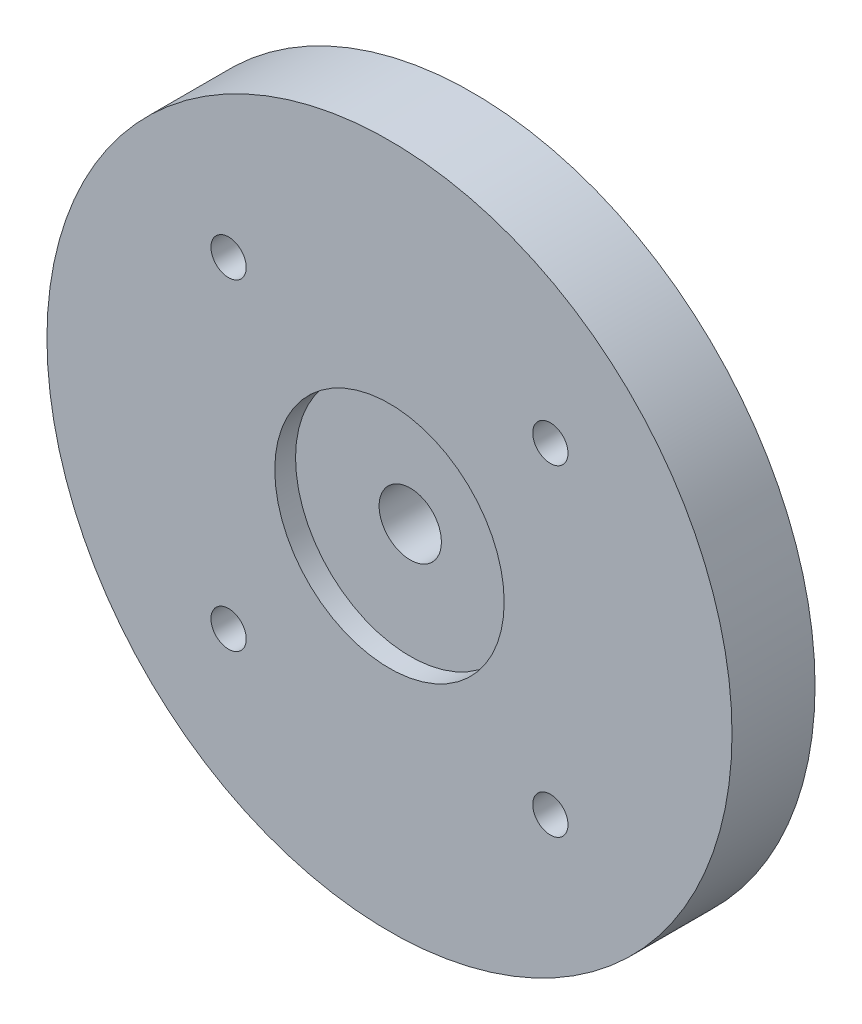
ISO-10303-21;
HEADER;
FILE_DESCRIPTION(('STEP AP214'),'2;1');
FILE_NAME('part.step','',(''),(''),'','','');
FILE_SCHEMA(('AUTOMOTIVE_DESIGN { 1 0 10303 214 1 1 1 1 }'));
ENDSEC;
DATA;
#1=APPLICATION_CONTEXT('core data for automotive mechanical design processes');
#2=APPLICATION_PROTOCOL_DEFINITION('international standard','automotive_design',2000,#1);
#3=PRODUCT_CONTEXT('',#1,'mechanical');
#4=PRODUCT('Part','Part','',(#3));
#5=PRODUCT_RELATED_PRODUCT_CATEGORY('part','',(#4));
#6=PRODUCT_DEFINITION_FORMATION('','',#4);
#7=PRODUCT_DEFINITION_CONTEXT('part definition',#1,'design');
#8=PRODUCT_DEFINITION('design','',#6,#7);
#9=PRODUCT_DEFINITION_SHAPE('','',#8);
#10=(LENGTH_UNIT() NAMED_UNIT(*) SI_UNIT(.MILLI.,.METRE.));
#11=(NAMED_UNIT(*) PLANE_ANGLE_UNIT() SI_UNIT($,.RADIAN.));
#12=(NAMED_UNIT(*) SI_UNIT($,.STERADIAN.) SOLID_ANGLE_UNIT());
#13=UNCERTAINTY_MEASURE_WITH_UNIT(LENGTH_MEASURE(1.E-05),#10,'distance_accuracy_value','');
#14=(GEOMETRIC_REPRESENTATION_CONTEXT(3) GLOBAL_UNCERTAINTY_ASSIGNED_CONTEXT((#13)) GLOBAL_UNIT_ASSIGNED_CONTEXT((#10,
#11,#12)) REPRESENTATION_CONTEXT('',''));
#15=CARTESIAN_POINT('',(0.,0.,0.));
#16=DIRECTION('',(0.,0.,1.));
#17=DIRECTION('',(1.,0.,0.));
#18=AXIS2_PLACEMENT_3D('',#15,#16,#17);
#19=CARTESIAN_POINT('',(0.,0.,-2.));
#20=DIRECTION('',(0.,0.,1.));
#21=DIRECTION('',(1.,0.,0.));
#22=AXIS2_PLACEMENT_3D('',#19,#20,#21);
#23=CYLINDRICAL_SURFACE('',#22,3.);
#24=CARTESIAN_POINT('',(0.,0.,-2.));
#25=DIRECTION('',(0.,0.,1.));
#26=DIRECTION('',(1.,0.,0.));
#27=AXIS2_PLACEMENT_3D('',#24,#25,#26);
#28=CIRCLE('',#27,3.);
#29=CARTESIAN_POINT('',(3.,0.,-2.));
#30=VERTEX_POINT('',#29);
#31=EDGE_CURVE('E61',#30,#30,#28,.T.);
#32=ORIENTED_EDGE('',*,*,#31,.F.);
#33=EDGE_LOOP('',(#32));
#34=FACE_BOUND('',#33,.T.);
#35=CARTESIAN_POINT('',(0.,0.,6.));
#36=DIRECTION('',(0.,0.,1.));
#37=DIRECTION('',(1.,0.,0.));
#38=AXIS2_PLACEMENT_3D('',#35,#36,#37);
#39=CIRCLE('',#38,3.);
#40=CARTESIAN_POINT('',(3.,0.,6.));
#41=VERTEX_POINT('',#40);
#42=EDGE_CURVE('E47',#41,#41,#39,.F.);
#43=ORIENTED_EDGE('',*,*,#42,.F.);
#44=EDGE_LOOP('',(#43));
#45=FACE_BOUND('',#44,.T.);
#46=ADVANCED_FACE('F43',(#34,#45),#23,.F.);
#47=CARTESIAN_POINT('',(-15.5,15.5,-2.));
#48=DIRECTION('',(0.,0.,1.));
#49=DIRECTION('',(1.,0.,0.));
#50=AXIS2_PLACEMENT_3D('',#47,#48,#49);
#51=CYLINDRICAL_SURFACE('',#50,1.7);
#52=CARTESIAN_POINT('',(-15.5,15.5,8.));
#53=DIRECTION('',(0.,0.,1.));
#54=DIRECTION('',(1.,0.,0.));
#55=AXIS2_PLACEMENT_3D('',#52,#53,#54);
#56=CIRCLE('',#55,1.7);
#57=CARTESIAN_POINT('',(-13.8,15.5,8.));
#58=VERTEX_POINT('',#57);
#59=EDGE_CURVE('E101',#58,#58,#56,.T.);
#60=ORIENTED_EDGE('',*,*,#59,.T.);
#61=EDGE_LOOP('',(#60));
#62=FACE_BOUND('',#61,.T.);
#63=CARTESIAN_POINT('',(-15.5,15.5,2.));
#64=DIRECTION('',(0.,0.,-1.));
#65=DIRECTION('',(-1.,0.,0.));
#66=AXIS2_PLACEMENT_3D('',#63,#64,#65);
#67=CIRCLE('',#66,1.7);
#68=CARTESIAN_POINT('',(-17.2,15.5,2.));
#69=VERTEX_POINT('',#68);
#70=EDGE_CURVE('E71',#69,#69,#67,.F.);
#71=ORIENTED_EDGE('',*,*,#70,.F.);
#72=EDGE_LOOP('',(#71));
#73=FACE_BOUND('',#72,.T.);
#74=ADVANCED_FACE('F154',(#62,#73),#51,.F.);
#75=CARTESIAN_POINT('',(15.5,15.5,-2.));
#76=DIRECTION('',(0.,0.,1.));
#77=DIRECTION('',(1.,0.,0.));
#78=AXIS2_PLACEMENT_3D('',#75,#76,#77);
#79=CYLINDRICAL_SURFACE('',#78,1.7);
#80=CARTESIAN_POINT('',(15.5,15.5,8.));
#81=DIRECTION('',(0.,0.,1.));
#82=DIRECTION('',(1.,0.,0.));
#83=AXIS2_PLACEMENT_3D('',#80,#81,#82);
#84=CIRCLE('',#83,1.7);
#85=CARTESIAN_POINT('',(17.2,15.5,8.));
#86=VERTEX_POINT('',#85);
#87=EDGE_CURVE('E98',#86,#86,#84,.T.);
#88=ORIENTED_EDGE('',*,*,#87,.T.);
#89=EDGE_LOOP('',(#88));
#90=FACE_BOUND('',#89,.T.);
#91=CARTESIAN_POINT('',(15.5,15.5,2.));
#92=DIRECTION('',(0.,0.,-1.));
#93=DIRECTION('',(-1.,0.,0.));
#94=AXIS2_PLACEMENT_3D('',#91,#92,#93);
#95=CIRCLE('',#94,1.7);
#96=CARTESIAN_POINT('',(13.8,15.5,2.));
#97=VERTEX_POINT('',#96);
#98=EDGE_CURVE('E74',#97,#97,#95,.F.);
#99=ORIENTED_EDGE('',*,*,#98,.F.);
#100=EDGE_LOOP('',(#99));
#101=FACE_BOUND('',#100,.T.);
#102=ADVANCED_FACE('F162',(#90,#101),#79,.F.);
#103=CARTESIAN_POINT('',(15.5,-15.5,-2.));
#104=DIRECTION('',(0.,0.,1.));
#105=DIRECTION('',(1.,0.,0.));
#106=AXIS2_PLACEMENT_3D('',#103,#104,#105);
#107=CYLINDRICAL_SURFACE('',#106,1.7);
#108=CARTESIAN_POINT('',(15.5,-15.5,8.));
#109=DIRECTION('',(0.,0.,1.));
#110=DIRECTION('',(1.,0.,0.));
#111=AXIS2_PLACEMENT_3D('',#108,#109,#110);
#112=CIRCLE('',#111,1.7);
#113=CARTESIAN_POINT('',(17.2,-15.5,8.));
#114=VERTEX_POINT('',#113);
#115=EDGE_CURVE('E95',#114,#114,#112,.T.);
#116=ORIENTED_EDGE('',*,*,#115,.T.);
#117=EDGE_LOOP('',(#116));
#118=FACE_BOUND('',#117,.T.);
#119=CARTESIAN_POINT('',(15.5,-15.5,2.));
#120=DIRECTION('',(0.,0.,-1.));
#121=DIRECTION('',(-1.,0.,0.));
#122=AXIS2_PLACEMENT_3D('',#119,#120,#121);
#123=CIRCLE('',#122,1.7);
#124=CARTESIAN_POINT('',(13.8,-15.5,2.));
#125=VERTEX_POINT('',#124);
#126=EDGE_CURVE('E77',#125,#125,#123,.F.);
#127=ORIENTED_EDGE('',*,*,#126,.F.);
#128=EDGE_LOOP('',(#127));
#129=FACE_BOUND('',#128,.T.);
#130=ADVANCED_FACE('F190',(#118,#129),#107,.F.);
#131=CARTESIAN_POINT('',(-15.5,-15.5,-2.));
#132=DIRECTION('',(0.,0.,1.));
#133=DIRECTION('',(1.,0.,0.));
#134=AXIS2_PLACEMENT_3D('',#131,#132,#133);
#135=CYLINDRICAL_SURFACE('',#134,1.7);
#136=CARTESIAN_POINT('',(-15.5,-15.5,8.));
#137=DIRECTION('',(0.,0.,1.));
#138=DIRECTION('',(1.,0.,0.));
#139=AXIS2_PLACEMENT_3D('',#136,#137,#138);
#140=CIRCLE('',#139,1.7);
#141=CARTESIAN_POINT('',(-13.8,-15.5,8.));
#142=VERTEX_POINT('',#141);
#143=EDGE_CURVE('E92',#142,#142,#140,.T.);
#144=ORIENTED_EDGE('',*,*,#143,.T.);
#145=EDGE_LOOP('',(#144));
#146=FACE_BOUND('',#145,.T.);
#147=CARTESIAN_POINT('',(-15.5,-15.5,2.));
#148=DIRECTION('',(0.,0.,-1.));
#149=DIRECTION('',(-1.,0.,0.));
#150=AXIS2_PLACEMENT_3D('',#147,#148,#149);
#151=CIRCLE('',#150,1.7);
#152=CARTESIAN_POINT('',(-17.2,-15.5,2.));
#153=VERTEX_POINT('',#152);
#154=EDGE_CURVE('E80',#153,#153,#151,.F.);
#155=ORIENTED_EDGE('',*,*,#154,.F.);
#156=EDGE_LOOP('',(#155));
#157=FACE_BOUND('',#156,.T.);
#158=ADVANCED_FACE('F167',(#146,#157),#135,.F.);
#159=CARTESIAN_POINT('',(0.,0.,8.));
#160=DIRECTION('',(0.,0.,-1.));
#161=DIRECTION('',(-1.,0.,0.));
#162=AXIS2_PLACEMENT_3D('',#159,#160,#161);
#163=CYLINDRICAL_SURFACE('',#162,33.);
#164=CARTESIAN_POINT('',(0.,0.,8.));
#165=DIRECTION('',(0.,0.,1.));
#166=DIRECTION('',(1.,0.,0.));
#167=AXIS2_PLACEMENT_3D('',#164,#165,#166);
#168=CIRCLE('',#167,33.);
#169=CARTESIAN_POINT('',(33.,0.,8.));
#170=VERTEX_POINT('',#169);
#171=EDGE_CURVE('E55',#170,#170,#168,.T.);
#172=ORIENTED_EDGE('',*,*,#171,.F.);
#173=EDGE_LOOP('',(#172));
#174=FACE_BOUND('',#173,.T.);
#175=CARTESIAN_POINT('',(0.,0.,0.));
#176=DIRECTION('',(0.,0.,1.));
#177=DIRECTION('',(1.,0.,0.));
#178=AXIS2_PLACEMENT_3D('',#175,#176,#177);
#179=CIRCLE('',#178,33.);
#180=CARTESIAN_POINT('',(33.,0.,0.));
#181=VERTEX_POINT('',#180);
#182=EDGE_CURVE('E84',#181,#181,#179,.T.);
#183=ORIENTED_EDGE('',*,*,#182,.T.);
#184=EDGE_LOOP('',(#183));
#185=FACE_BOUND('',#184,.T.);
#186=ADVANCED_FACE('F182',(#174,#185),#163,.T.);
#187=CARTESIAN_POINT('',(0.,0.,8.));
#188=DIRECTION('',(0.,0.,1.));
#189=DIRECTION('',(1.,0.,0.));
#190=AXIS2_PLACEMENT_3D('',#187,#188,#189);
#191=PLANE('',#190);
#192=CARTESIAN_POINT('',(0.,0.,8.));
#193=DIRECTION('',(0.,0.,1.));
#194=DIRECTION('',(1.,0.,0.));
#195=AXIS2_PLACEMENT_3D('',#192,#193,#194);
#196=CIRCLE('',#195,11.05);
#197=CARTESIAN_POINT('',(11.05,0.,8.));
#198=VERTEX_POINT('',#197);
#199=EDGE_CURVE('E141',#198,#198,#196,.T.);
#200=ORIENTED_EDGE('',*,*,#199,.F.);
#201=EDGE_LOOP('',(#200));
#202=FACE_BOUND('',#201,.T.);
#203=ORIENTED_EDGE('',*,*,#143,.F.);
#204=EDGE_LOOP('',(#203));
#205=FACE_BOUND('',#204,.T.);
#206=ORIENTED_EDGE('',*,*,#115,.F.);
#207=EDGE_LOOP('',(#206));
#208=FACE_BOUND('',#207,.T.);
#209=ORIENTED_EDGE('',*,*,#87,.F.);
#210=EDGE_LOOP('',(#209));
#211=FACE_BOUND('',#210,.T.);
#212=ORIENTED_EDGE('',*,*,#59,.F.);
#213=EDGE_LOOP('',(#212));
#214=FACE_BOUND('',#213,.T.);
#215=ORIENTED_EDGE('',*,*,#171,.T.);
#216=EDGE_LOOP('',(#215));
#217=FACE_BOUND('',#216,.T.);
#218=ADVANCED_FACE('F180',(#202,#205,#208,#211,#214,#217),#191,.T.);
#219=CARTESIAN_POINT('',(0.,0.,0.));
#220=DIRECTION('',(0.,0.,1.));
#221=DIRECTION('',(1.,0.,0.));
#222=AXIS2_PLACEMENT_3D('',#219,#220,#221);
#223=PLANE('',#222);
#224=CARTESIAN_POINT('',(0.,0.,0.));
#225=DIRECTION('',(0.,0.,1.));
#226=DIRECTION('',(1.,0.,0.));
#227=AXIS2_PLACEMENT_3D('',#224,#225,#226);
#228=CIRCLE('',#227,11.);
#229=CARTESIAN_POINT('',(11.,0.,0.));
#230=VERTEX_POINT('',#229);
#231=EDGE_CURVE('E10',#230,#230,#228,.T.);
#232=ORIENTED_EDGE('',*,*,#231,.T.);
#233=EDGE_LOOP('',(#232));
#234=FACE_BOUND('',#233,.T.);
#235=CARTESIAN_POINT('',(0.,29.5,0.));
#236=DIRECTION('',(0.,0.,-1.));
#237=DIRECTION('',(-1.,0.,0.));
#238=AXIS2_PLACEMENT_3D('',#235,#236,#237);
#239=CIRCLE('',#238,2.1);
#240=CARTESIAN_POINT('',(-2.1,29.5,0.));
#241=VERTEX_POINT('',#240);
#242=EDGE_CURVE('E136',#241,#241,#239,.T.);
#243=ORIENTED_EDGE('',*,*,#242,.F.);
#244=EDGE_LOOP('',(#243));
#245=FACE_BOUND('',#244,.T.);
#246=CARTESIAN_POINT('',(-29.5,-5.65519853168439E-13,0.));
#247=DIRECTION('',(0.,0.,-1.));
#248=DIRECTION('',(-1.,0.,0.));
#249=AXIS2_PLACEMENT_3D('',#246,#247,#248);
#250=CIRCLE('',#249,2.1);
#251=CARTESIAN_POINT('',(-31.6,-5.65519853168439E-13,0.));
#252=VERTEX_POINT('',#251);
#253=EDGE_CURVE('E133',#252,#252,#250,.T.);
#254=ORIENTED_EDGE('',*,*,#253,.F.);
#255=EDGE_LOOP('',(#254));
#256=FACE_BOUND('',#255,.T.);
#257=CARTESIAN_POINT('',(6.96595987118696E-13,-29.5,0.));
#258=DIRECTION('',(0.,0.,-1.));
#259=DIRECTION('',(-1.,0.,0.));
#260=AXIS2_PLACEMENT_3D('',#257,#258,#259);
#261=CIRCLE('',#260,2.1);
#262=CARTESIAN_POINT('',(-2.0999999999993,-29.5,0.));
#263=VERTEX_POINT('',#262);
#264=EDGE_CURVE('E127',#263,#263,#261,.T.);
#265=ORIENTED_EDGE('',*,*,#264,.F.);
#266=EDGE_LOOP('',(#265));
#267=FACE_BOUND('',#266,.T.);
#268=CARTESIAN_POINT('',(29.5000000000006,0.,0.));
#269=DIRECTION('',(0.,0.,-1.));
#270=DIRECTION('',(-1.,0.,0.));
#271=AXIS2_PLACEMENT_3D('',#268,#269,#270);
#272=CIRCLE('',#271,2.10000000000062);
#273=CARTESIAN_POINT('',(27.3999999999999,0.,0.));
#274=VERTEX_POINT('',#273);
#275=EDGE_CURVE('E121',#274,#274,#272,.T.);
#276=ORIENTED_EDGE('',*,*,#275,.F.);
#277=EDGE_LOOP('',(#276));
#278=FACE_BOUND('',#277,.T.);
#279=CARTESIAN_POINT('',(15.5,-15.5,0.));
#280=DIRECTION('',(0.,0.,1.));
#281=DIRECTION('',(1.,0.,0.));
#282=AXIS2_PLACEMENT_3D('',#279,#280,#281);
#283=CIRCLE('',#282,2.8);
#284=CARTESIAN_POINT('',(18.3,-15.5,0.));
#285=VERTEX_POINT('',#284);
#286=EDGE_CURVE('E58',#285,#285,#283,.F.);
#287=ORIENTED_EDGE('',*,*,#286,.F.);
#288=EDGE_LOOP('',(#287));
#289=FACE_BOUND('',#288,.T.);
#290=CARTESIAN_POINT('',(-15.5,-15.5,0.));
#291=DIRECTION('',(0.,0.,1.));
#292=DIRECTION('',(1.,0.,0.));
#293=AXIS2_PLACEMENT_3D('',#290,#291,#292);
#294=CIRCLE('',#293,2.8);
#295=CARTESIAN_POINT('',(-12.7,-15.5,0.));
#296=VERTEX_POINT('',#295);
#297=EDGE_CURVE('E62',#296,#296,#294,.F.);
#298=ORIENTED_EDGE('',*,*,#297,.F.);
#299=EDGE_LOOP('',(#298));
#300=FACE_BOUND('',#299,.T.);
#301=CARTESIAN_POINT('',(-15.5,15.5,0.));
#302=DIRECTION('',(0.,0.,1.));
#303=DIRECTION('',(1.,0.,0.));
#304=AXIS2_PLACEMENT_3D('',#301,#302,#303);
#305=CIRCLE('',#304,2.8);
#306=CARTESIAN_POINT('',(-12.7,15.5,0.));
#307=VERTEX_POINT('',#306);
#308=EDGE_CURVE('E65',#307,#307,#305,.F.);
#309=ORIENTED_EDGE('',*,*,#308,.F.);
#310=EDGE_LOOP('',(#309));
#311=FACE_BOUND('',#310,.T.);
#312=CARTESIAN_POINT('',(15.5,15.5,0.));
#313=DIRECTION('',(0.,0.,1.));
#314=DIRECTION('',(1.,0.,0.));
#315=AXIS2_PLACEMENT_3D('',#312,#313,#314);
#316=CIRCLE('',#315,2.8);
#317=CARTESIAN_POINT('',(18.3,15.5,0.));
#318=VERTEX_POINT('',#317);
#319=EDGE_CURVE('E68',#318,#318,#316,.F.);
#320=ORIENTED_EDGE('',*,*,#319,.F.);
#321=EDGE_LOOP('',(#320));
#322=FACE_BOUND('',#321,.T.);
#323=ORIENTED_EDGE('',*,*,#182,.F.);
#324=EDGE_LOOP('',(#323));
#325=FACE_BOUND('',#324,.T.);
#326=ADVANCED_FACE('F178',(#234,#245,#256,#267,#278,#289,#300,#311,#322,#325),#223,.F.);
#327=CARTESIAN_POINT('',(0.,0.,-2.));
#328=DIRECTION('',(0.,0.,1.));
#329=DIRECTION('',(1.,0.,0.));
#330=AXIS2_PLACEMENT_3D('',#327,#328,#329);
#331=CYLINDRICAL_SURFACE('',#330,10.);
#332=CARTESIAN_POINT('',(0.,0.,-1.));
#333=DIRECTION('',(0.,0.,1.));
#334=DIRECTION('',(1.,0.,0.));
#335=AXIS2_PLACEMENT_3D('',#332,#333,#334);
#336=CIRCLE('',#335,10.);
#337=CARTESIAN_POINT('',(10.,0.,-1.));
#338=VERTEX_POINT('',#337);
#339=EDGE_CURVE('E51',#338,#338,#336,.F.);
#340=ORIENTED_EDGE('',*,*,#339,.T.);
#341=EDGE_LOOP('',(#340));
#342=FACE_BOUND('',#341,.T.);
#343=CARTESIAN_POINT('',(0.,0.,-2.));
#344=DIRECTION('',(0.,0.,-1.));
#345=DIRECTION('',(-1.,0.,0.));
#346=AXIS2_PLACEMENT_3D('',#343,#344,#345);
#347=CIRCLE('',#346,10.);
#348=CARTESIAN_POINT('',(-10.,0.,-2.));
#349=VERTEX_POINT('',#348);
#350=EDGE_CURVE('E87',#349,#349,#347,.T.);
#351=ORIENTED_EDGE('',*,*,#350,.F.);
#352=EDGE_LOOP('',(#351));
#353=FACE_BOUND('',#352,.T.);
#354=ADVANCED_FACE('F174',(#342,#353),#331,.T.);
#355=CARTESIAN_POINT('',(0.,0.,-2.));
#356=DIRECTION('',(0.,0.,-1.));
#357=DIRECTION('',(-1.,0.,0.));
#358=AXIS2_PLACEMENT_3D('',#355,#356,#357);
#359=PLANE('',#358);
#360=ORIENTED_EDGE('',*,*,#31,.T.);
#361=EDGE_LOOP('',(#360));
#362=FACE_BOUND('',#361,.T.);
#363=ORIENTED_EDGE('',*,*,#350,.T.);
#364=EDGE_LOOP('',(#363));
#365=FACE_BOUND('',#364,.T.);
#366=ADVANCED_FACE('F170',(#362,#365),#359,.T.);
#367=CARTESIAN_POINT('',(-15.5,-15.5,-2.));
#368=DIRECTION('',(0.,0.,1.));
#369=DIRECTION('',(1.,0.,0.));
#370=AXIS2_PLACEMENT_3D('',#367,#368,#369);
#371=CYLINDRICAL_SURFACE('',#370,2.8);
#372=CARTESIAN_POINT('',(-15.5,-15.5,2.));
#373=DIRECTION('',(0.,0.,-1.));
#374=DIRECTION('',(-1.,0.,0.));
#375=AXIS2_PLACEMENT_3D('',#372,#373,#374);
#376=CIRCLE('',#375,2.8);
#377=CARTESIAN_POINT('',(-18.3,-15.5,2.));
#378=VERTEX_POINT('',#377);
#379=EDGE_CURVE('E112',#378,#378,#376,.T.);
#380=ORIENTED_EDGE('',*,*,#379,.F.);
#381=EDGE_LOOP('',(#380));
#382=FACE_BOUND('',#381,.T.);
#383=ORIENTED_EDGE('',*,*,#297,.T.);
#384=EDGE_LOOP('',(#383));
#385=FACE_BOUND('',#384,.T.);
#386=ADVANCED_FACE('F173',(#382,#385),#371,.F.);
#387=CARTESIAN_POINT('',(-15.5,-15.5,2.));
#388=DIRECTION('',(0.,0.,-1.));
#389=DIRECTION('',(-1.,0.,0.));
#390=AXIS2_PLACEMENT_3D('',#387,#388,#389);
#391=PLANE('',#390);
#392=ORIENTED_EDGE('',*,*,#379,.T.);
#393=EDGE_LOOP('',(#392));
#394=FACE_BOUND('',#393,.T.);
#395=ORIENTED_EDGE('',*,*,#154,.T.);
#396=EDGE_LOOP('',(#395));
#397=FACE_BOUND('',#396,.T.);
#398=ADVANCED_FACE('F206',(#394,#397),#391,.T.);
#399=CARTESIAN_POINT('',(15.5,-15.5,-2.));
#400=DIRECTION('',(0.,0.,1.));
#401=DIRECTION('',(1.,0.,0.));
#402=AXIS2_PLACEMENT_3D('',#399,#400,#401);
#403=CYLINDRICAL_SURFACE('',#402,2.8);
#404=CARTESIAN_POINT('',(15.5,-15.5,2.));
#405=DIRECTION('',(0.,0.,-1.));
#406=DIRECTION('',(-1.,0.,0.));
#407=AXIS2_PLACEMENT_3D('',#404,#405,#406);
#408=CIRCLE('',#407,2.8);
#409=CARTESIAN_POINT('',(12.7,-15.5,2.));
#410=VERTEX_POINT('',#409);
#411=EDGE_CURVE('E109',#410,#410,#408,.T.);
#412=ORIENTED_EDGE('',*,*,#411,.F.);
#413=EDGE_LOOP('',(#412));
#414=FACE_BOUND('',#413,.T.);
#415=ORIENTED_EDGE('',*,*,#286,.T.);
#416=EDGE_LOOP('',(#415));
#417=FACE_BOUND('',#416,.T.);
#418=ADVANCED_FACE('F208',(#414,#417),#403,.F.);
#419=CARTESIAN_POINT('',(15.5,-15.5,2.));
#420=DIRECTION('',(0.,0.,-1.));
#421=DIRECTION('',(-1.,0.,0.));
#422=AXIS2_PLACEMENT_3D('',#419,#420,#421);
#423=PLANE('',#422);
#424=ORIENTED_EDGE('',*,*,#411,.T.);
#425=EDGE_LOOP('',(#424));
#426=FACE_BOUND('',#425,.T.);
#427=ORIENTED_EDGE('',*,*,#126,.T.);
#428=EDGE_LOOP('',(#427));
#429=FACE_BOUND('',#428,.T.);
#430=ADVANCED_FACE('F214',(#426,#429),#423,.T.);
#431=CARTESIAN_POINT('',(15.5,15.5,-2.));
#432=DIRECTION('',(0.,0.,1.));
#433=DIRECTION('',(1.,0.,0.));
#434=AXIS2_PLACEMENT_3D('',#431,#432,#433);
#435=CYLINDRICAL_SURFACE('',#434,2.8);
#436=CARTESIAN_POINT('',(15.5,15.5,2.));
#437=DIRECTION('',(0.,0.,-1.));
#438=DIRECTION('',(-1.,0.,0.));
#439=AXIS2_PLACEMENT_3D('',#436,#437,#438);
#440=CIRCLE('',#439,2.8);
#441=CARTESIAN_POINT('',(12.7,15.5,2.));
#442=VERTEX_POINT('',#441);
#443=EDGE_CURVE('E83',#442,#442,#440,.T.);
#444=ORIENTED_EDGE('',*,*,#443,.F.);
#445=EDGE_LOOP('',(#444));
#446=FACE_BOUND('',#445,.T.);
#447=ORIENTED_EDGE('',*,*,#319,.T.);
#448=EDGE_LOOP('',(#447));
#449=FACE_BOUND('',#448,.T.);
#450=ADVANCED_FACE('F223',(#446,#449),#435,.F.);
#451=CARTESIAN_POINT('',(15.5,15.5,2.));
#452=DIRECTION('',(0.,0.,-1.));
#453=DIRECTION('',(-1.,0.,0.));
#454=AXIS2_PLACEMENT_3D('',#451,#452,#453);
#455=PLANE('',#454);
#456=ORIENTED_EDGE('',*,*,#443,.T.);
#457=EDGE_LOOP('',(#456));
#458=FACE_BOUND('',#457,.T.);
#459=ORIENTED_EDGE('',*,*,#98,.T.);
#460=EDGE_LOOP('',(#459));
#461=FACE_BOUND('',#460,.T.);
#462=ADVANCED_FACE('F225',(#458,#461),#455,.T.);
#463=CARTESIAN_POINT('',(-15.5,15.5,-2.));
#464=DIRECTION('',(0.,0.,1.));
#465=DIRECTION('',(1.,0.,0.));
#466=AXIS2_PLACEMENT_3D('',#463,#464,#465);
#467=CYLINDRICAL_SURFACE('',#466,2.8);
#468=CARTESIAN_POINT('',(-15.5,15.5,2.));
#469=DIRECTION('',(0.,0.,-1.));
#470=DIRECTION('',(-1.,0.,0.));
#471=AXIS2_PLACEMENT_3D('',#468,#469,#470);
#472=CIRCLE('',#471,2.8);
#473=CARTESIAN_POINT('',(-18.3,15.5,2.));
#474=VERTEX_POINT('',#473);
#475=EDGE_CURVE('E108',#474,#474,#472,.T.);
#476=ORIENTED_EDGE('',*,*,#475,.F.);
#477=EDGE_LOOP('',(#476));
#478=FACE_BOUND('',#477,.T.);
#479=ORIENTED_EDGE('',*,*,#308,.T.);
#480=EDGE_LOOP('',(#479));
#481=FACE_BOUND('',#480,.T.);
#482=ADVANCED_FACE('F228',(#478,#481),#467,.F.);
#483=CARTESIAN_POINT('',(-15.5,15.5,2.));
#484=DIRECTION('',(0.,0.,-1.));
#485=DIRECTION('',(-1.,0.,0.));
#486=AXIS2_PLACEMENT_3D('',#483,#484,#485);
#487=PLANE('',#486);
#488=ORIENTED_EDGE('',*,*,#475,.T.);
#489=EDGE_LOOP('',(#488));
#490=FACE_BOUND('',#489,.T.);
#491=ORIENTED_EDGE('',*,*,#70,.T.);
#492=EDGE_LOOP('',(#491));
#493=FACE_BOUND('',#492,.T.);
#494=ADVANCED_FACE('F247',(#490,#493),#487,.T.);
#495=CARTESIAN_POINT('',(29.5000000000006,0.,6.));
#496=DIRECTION('',(0.,0.,-1.));
#497=DIRECTION('',(-1.,0.,0.));
#498=AXIS2_PLACEMENT_3D('',#495,#496,#497);
#499=CYLINDRICAL_SURFACE('',#498,2.10000000000062);
#500=CARTESIAN_POINT('',(29.5000000000006,0.,6.));
#501=DIRECTION('',(0.,0.,-1.));
#502=DIRECTION('',(-1.,0.,0.));
#503=AXIS2_PLACEMENT_3D('',#500,#501,#502);
#504=CIRCLE('',#503,2.10000000000062);
#505=CARTESIAN_POINT('',(27.3999999999999,0.,6.));
#506=VERTEX_POINT('',#505);
#507=EDGE_CURVE('E118',#506,#506,#504,.T.);
#508=ORIENTED_EDGE('',*,*,#507,.F.);
#509=EDGE_LOOP('',(#508));
#510=FACE_BOUND('',#509,.T.);
#511=ORIENTED_EDGE('',*,*,#275,.T.);
#512=EDGE_LOOP('',(#511));
#513=FACE_BOUND('',#512,.T.);
#514=ADVANCED_FACE('F249',(#510,#513),#499,.F.);
#515=CARTESIAN_POINT('',(29.5000000000006,0.,6.));
#516=DIRECTION('',(0.,0.,-1.));
#517=DIRECTION('',(-1.,0.,0.));
#518=AXIS2_PLACEMENT_3D('',#515,#516,#517);
#519=PLANE('',#518);
#520=ORIENTED_EDGE('',*,*,#507,.T.);
#521=EDGE_LOOP('',(#520));
#522=FACE_BOUND('',#521,.T.);
#523=ADVANCED_FACE('F255',(#522),#519,.T.);
#524=CARTESIAN_POINT('',(6.96595987118696E-13,-29.5,6.));
#525=DIRECTION('',(0.,0.,-1.));
#526=DIRECTION('',(-1.,0.,0.));
#527=AXIS2_PLACEMENT_3D('',#524,#525,#526);
#528=CYLINDRICAL_SURFACE('',#527,2.1);
#529=CARTESIAN_POINT('',(6.96595987118696E-13,-29.5,6.));
#530=DIRECTION('',(0.,0.,-1.));
#531=DIRECTION('',(-1.,0.,0.));
#532=AXIS2_PLACEMENT_3D('',#529,#530,#531);
#533=CIRCLE('',#532,2.1);
#534=CARTESIAN_POINT('',(-2.0999999999993,-29.5,6.));
#535=VERTEX_POINT('',#534);
#536=EDGE_CURVE('E124',#535,#535,#533,.T.);
#537=ORIENTED_EDGE('',*,*,#536,.F.);
#538=EDGE_LOOP('',(#537));
#539=FACE_BOUND('',#538,.T.);
#540=ORIENTED_EDGE('',*,*,#264,.T.);
#541=EDGE_LOOP('',(#540));
#542=FACE_BOUND('',#541,.T.);
#543=ADVANCED_FACE('F262',(#539,#542),#528,.F.);
#544=CARTESIAN_POINT('',(6.96595987118696E-13,-29.5,6.));
#545=DIRECTION('',(0.,0.,-1.));
#546=DIRECTION('',(-1.,0.,0.));
#547=AXIS2_PLACEMENT_3D('',#544,#545,#546);
#548=PLANE('',#547);
#549=ORIENTED_EDGE('',*,*,#536,.T.);
#550=EDGE_LOOP('',(#549));
#551=FACE_BOUND('',#550,.T.);
#552=ADVANCED_FACE('F265',(#551),#548,.T.);
#553=CARTESIAN_POINT('',(-29.5,-5.65519853168439E-13,6.));
#554=DIRECTION('',(0.,0.,-1.));
#555=DIRECTION('',(-1.,0.,0.));
#556=AXIS2_PLACEMENT_3D('',#553,#554,#555);
#557=CYLINDRICAL_SURFACE('',#556,2.1);
#558=CARTESIAN_POINT('',(-29.5,-5.65519853168439E-13,6.));
#559=DIRECTION('',(0.,0.,-1.));
#560=DIRECTION('',(-1.,0.,0.));
#561=AXIS2_PLACEMENT_3D('',#558,#559,#560);
#562=CIRCLE('',#561,2.1);
#563=CARTESIAN_POINT('',(-31.6,-5.65519853168439E-13,6.));
#564=VERTEX_POINT('',#563);
#565=EDGE_CURVE('E130',#564,#564,#562,.T.);
#566=ORIENTED_EDGE('',*,*,#565,.F.);
#567=EDGE_LOOP('',(#566));
#568=FACE_BOUND('',#567,.T.);
#569=ORIENTED_EDGE('',*,*,#253,.T.);
#570=EDGE_LOOP('',(#569));
#571=FACE_BOUND('',#570,.T.);
#572=ADVANCED_FACE('F268',(#568,#571),#557,.F.);
#573=CARTESIAN_POINT('',(-29.5,-5.65519853168439E-13,6.));
#574=DIRECTION('',(0.,0.,-1.));
#575=DIRECTION('',(-1.,0.,0.));
#576=AXIS2_PLACEMENT_3D('',#573,#574,#575);
#577=PLANE('',#576);
#578=ORIENTED_EDGE('',*,*,#565,.T.);
#579=EDGE_LOOP('',(#578));
#580=FACE_BOUND('',#579,.T.);
#581=ADVANCED_FACE('F273',(#580),#577,.T.);
#582=CARTESIAN_POINT('',(0.,29.5,6.));
#583=DIRECTION('',(0.,0.,-1.));
#584=DIRECTION('',(-1.,0.,0.));
#585=AXIS2_PLACEMENT_3D('',#582,#583,#584);
#586=CYLINDRICAL_SURFACE('',#585,2.1);
#587=CARTESIAN_POINT('',(0.,29.5,6.));
#588=DIRECTION('',(0.,0.,-1.));
#589=DIRECTION('',(-1.,0.,0.));
#590=AXIS2_PLACEMENT_3D('',#587,#588,#589);
#591=CIRCLE('',#590,2.1);
#592=CARTESIAN_POINT('',(-2.1,29.5,6.));
#593=VERTEX_POINT('',#592);
#594=EDGE_CURVE('E113',#593,#593,#591,.T.);
#595=ORIENTED_EDGE('',*,*,#594,.F.);
#596=EDGE_LOOP('',(#595));
#597=FACE_BOUND('',#596,.T.);
#598=ORIENTED_EDGE('',*,*,#242,.T.);
#599=EDGE_LOOP('',(#598));
#600=FACE_BOUND('',#599,.T.);
#601=ADVANCED_FACE('F276',(#597,#600),#586,.F.);
#602=CARTESIAN_POINT('',(0.,29.5,6.));
#603=DIRECTION('',(0.,0.,-1.));
#604=DIRECTION('',(-1.,0.,0.));
#605=AXIS2_PLACEMENT_3D('',#602,#603,#604);
#606=PLANE('',#605);
#607=ORIENTED_EDGE('',*,*,#594,.T.);
#608=EDGE_LOOP('',(#607));
#609=FACE_BOUND('',#608,.T.);
#610=ADVANCED_FACE('F283',(#609),#606,.T.);
#611=CARTESIAN_POINT('',(0.,0.,-1.));
#612=DIRECTION('',(0.,0.,1.));
#613=DIRECTION('',(1.,0.,0.));
#614=AXIS2_PLACEMENT_3D('',#611,#612,#613);
#615=TOROIDAL_SURFACE('',#614,11.,1.);
#616=ORIENTED_EDGE('',*,*,#231,.F.);
#617=EDGE_LOOP('',(#616));
#618=FACE_BOUND('',#617,.T.);
#619=ORIENTED_EDGE('',*,*,#339,.F.);
#620=EDGE_LOOP('',(#619));
#621=FACE_BOUND('',#620,.T.);
#622=ADVANCED_FACE('F45',(#618,#621),#615,.F.);
#623=CARTESIAN_POINT('',(0.,0.,6.));
#624=DIRECTION('',(0.,0.,1.));
#625=DIRECTION('',(1.,0.,0.));
#626=AXIS2_PLACEMENT_3D('',#623,#624,#625);
#627=PLANE('',#626);
#628=CARTESIAN_POINT('',(0.,0.,6.));
#629=DIRECTION('',(0.,0.,1.));
#630=DIRECTION('',(1.,0.,0.));
#631=AXIS2_PLACEMENT_3D('',#628,#629,#630);
#632=CIRCLE('',#631,11.05);
#633=CARTESIAN_POINT('',(11.05,0.,6.));
#634=VERTEX_POINT('',#633);
#635=EDGE_CURVE('E144',#634,#634,#632,.T.);
#636=ORIENTED_EDGE('',*,*,#635,.T.);
#637=EDGE_LOOP('',(#636));
#638=FACE_BOUND('',#637,.T.);
#639=ORIENTED_EDGE('',*,*,#42,.T.);
#640=EDGE_LOOP('',(#639));
#641=FACE_BOUND('',#640,.T.);
#642=ADVANCED_FACE('F151',(#638,#641),#627,.T.);
#643=CARTESIAN_POINT('',(0.,0.,6.));
#644=DIRECTION('',(0.,0.,1.));
#645=DIRECTION('',(1.,0.,0.));
#646=AXIS2_PLACEMENT_3D('',#643,#644,#645);
#647=CYLINDRICAL_SURFACE('',#646,11.05);
#648=ORIENTED_EDGE('',*,*,#635,.F.);
#649=EDGE_LOOP('',(#648));
#650=FACE_BOUND('',#649,.T.);
#651=ORIENTED_EDGE('',*,*,#199,.T.);
#652=EDGE_LOOP('',(#651));
#653=FACE_BOUND('',#652,.T.);
#654=ADVANCED_FACE('F288',(#650,#653),#647,.F.);
#655=CLOSED_SHELL('',(#46,#74,#102,#130,#158,#186,#218,#326,#354,#366,#386,#398,#418,#430,#450,
#462,#482,#494,#514,#523,#543,#552,#572,#581,#601,#610,#622,#642,#654));
#656=MANIFOLD_SOLID_BREP('B2',#655);
#657=ADVANCED_BREP_SHAPE_REPRESENTATION('',(#18,#656),#14);
#658=SHAPE_DEFINITION_REPRESENTATION(#9,#657);
ENDSEC;
END-ISO-10303-21;
